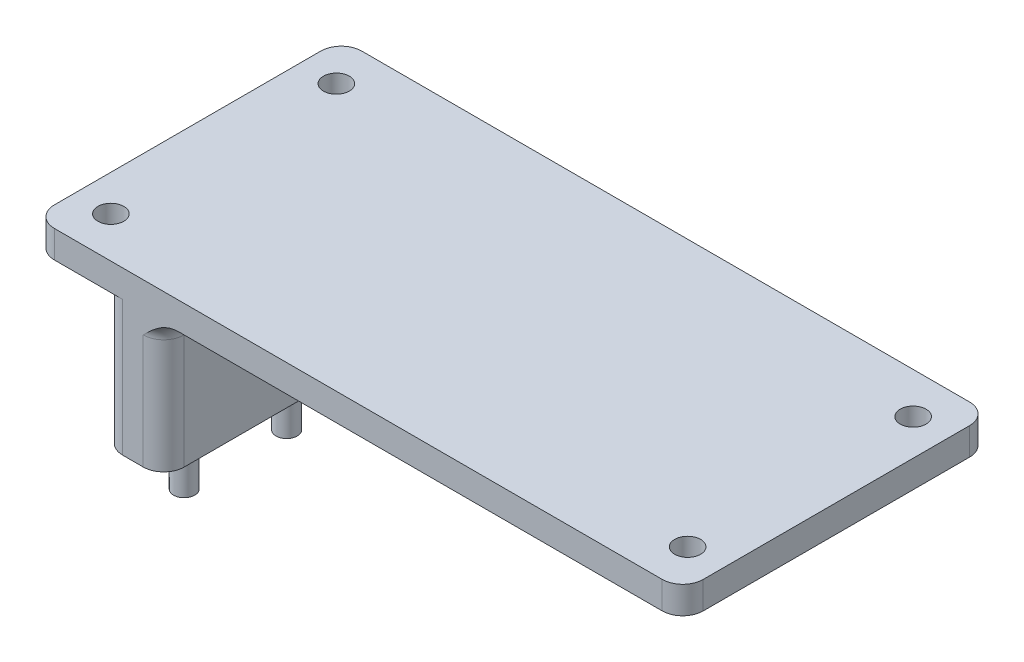
ISO-10303-21;
HEADER;
FILE_DESCRIPTION(('STEP AP214'),'2;1');
FILE_NAME('part.step','',(''),(''),'','','');
FILE_SCHEMA(('AUTOMOTIVE_DESIGN { 1 0 10303 214 1 1 1 1 }'));
ENDSEC;
DATA;
#1=APPLICATION_CONTEXT('core data for automotive mechanical design processes');
#2=APPLICATION_PROTOCOL_DEFINITION('international standard','automotive_design',2000,#1);
#3=PRODUCT_CONTEXT('',#1,'mechanical');
#4=PRODUCT('Part','Part','',(#3));
#5=PRODUCT_RELATED_PRODUCT_CATEGORY('part','',(#4));
#6=PRODUCT_DEFINITION_FORMATION('','',#4);
#7=PRODUCT_DEFINITION_CONTEXT('part definition',#1,'design');
#8=PRODUCT_DEFINITION('design','',#6,#7);
#9=PRODUCT_DEFINITION_SHAPE('','',#8);
#10=(LENGTH_UNIT() NAMED_UNIT(*) SI_UNIT(.MILLI.,.METRE.));
#11=(NAMED_UNIT(*) PLANE_ANGLE_UNIT() SI_UNIT($,.RADIAN.));
#12=(NAMED_UNIT(*) SI_UNIT($,.STERADIAN.) SOLID_ANGLE_UNIT());
#13=UNCERTAINTY_MEASURE_WITH_UNIT(LENGTH_MEASURE(1.E-05),#10,'distance_accuracy_value','');
#14=(GEOMETRIC_REPRESENTATION_CONTEXT(3) GLOBAL_UNCERTAINTY_ASSIGNED_CONTEXT((#13)) GLOBAL_UNIT_ASSIGNED_CONTEXT((#10,
#11,#12)) REPRESENTATION_CONTEXT('',''));
#15=CARTESIAN_POINT('',(0.,0.,0.));
#16=DIRECTION('',(0.,0.,1.));
#17=DIRECTION('',(1.,0.,0.));
#18=AXIS2_PLACEMENT_3D('',#15,#16,#17);
#19=CARTESIAN_POINT('',(0.,23.75,0.));
#20=DIRECTION('',(1.,0.,0.));
#21=DIRECTION('',(0.,0.,-1.));
#22=AXIS2_PLACEMENT_3D('',#19,#20,#21);
#23=PLANE('',#22);
#24=DIRECTION('',(0.,0.,1.));
#25=VECTOR('',#24,1.);
#26=CARTESIAN_POINT('',(0.,0.,0.));
#27=LINE('',#26,#25);
#28=CARTESIAN_POINT('',(0.,0.,-42.));
#29=VERTEX_POINT('',#28);
#30=CARTESIAN_POINT('',(0.,0.,-3.));
#31=VERTEX_POINT('',#30);
#32=EDGE_CURVE('E378',#29,#31,#27,.T.);
#33=ORIENTED_EDGE('',*,*,#32,.T.);
#34=DIRECTION('',(0.,-1.,0.));
#35=VECTOR('',#34,1.);
#36=CARTESIAN_POINT('',(0.,23.75,-3.));
#37=LINE('',#36,#35);
#38=CARTESIAN_POINT('',(0.,19.75,-3.));
#39=VERTEX_POINT('',#38);
#40=EDGE_CURVE('E235',#31,#39,#37,.F.);
#41=ORIENTED_EDGE('',*,*,#40,.T.);
#42=DIRECTION('',(0.,0.,-1.));
#43=VECTOR('',#42,1.);
#44=CARTESIAN_POINT('',(0.,19.75,0.));
#45=LINE('',#44,#43);
#46=CARTESIAN_POINT('',(0.,19.75,-42.));
#47=VERTEX_POINT('',#46);
#48=EDGE_CURVE('E353',#39,#47,#45,.T.);
#49=ORIENTED_EDGE('',*,*,#48,.T.);
#50=DIRECTION('',(0.,-1.,0.));
#51=VECTOR('',#50,1.);
#52=CARTESIAN_POINT('',(0.,23.75,-42.));
#53=LINE('',#52,#51);
#54=EDGE_CURVE('E232',#47,#29,#53,.T.);
#55=ORIENTED_EDGE('',*,*,#54,.T.);
#56=EDGE_LOOP('',(#33,#41,#49,#55));
#57=FACE_BOUND('',#56,.T.);
#58=ADVANCED_FACE('F37',(#57),#23,.F.);
#59=CARTESIAN_POINT('',(0.,23.75,0.));
#60=DIRECTION('',(0.,0.,-1.));
#61=DIRECTION('',(-1.,0.,0.));
#62=AXIS2_PLACEMENT_3D('',#59,#60,#61);
#63=PLANE('',#62);
#64=DIRECTION('',(0.,-1.,0.));
#65=VECTOR('',#64,1.);
#66=CARTESIAN_POINT('',(6.,23.75,0.));
#67=LINE('',#66,#65);
#68=CARTESIAN_POINT('',(6.,0.,0.));
#69=VERTEX_POINT('',#68);
#70=CARTESIAN_POINT('',(6.,16.75,0.));
#71=VERTEX_POINT('',#70);
#72=EDGE_CURVE('E193',#69,#71,#67,.F.);
#73=ORIENTED_EDGE('',*,*,#72,.T.);
#74=CARTESIAN_POINT('',(11.1961524227066,19.75,0.));
#75=CARTESIAN_POINT('',(11.0676094597601,19.750017817897,0.));
#76=CARTESIAN_POINT('',(10.9391415632197,19.7438066101621,0.));
#77=CARTESIAN_POINT('',(10.6834814339214,19.7197793774165,0.));
#78=CARTESIAN_POINT('',(10.5562875584729,19.7019810125627,0.));
#79=CARTESIAN_POINT('',(10.3054246442278,19.655906860044,0.));
#80=CARTESIAN_POINT('',(10.1817316014713,19.6277598752298,0.));
#81=CARTESIAN_POINT('',(9.93689826853327,19.5618415929699,0.));
#82=CARTESIAN_POINT('',(9.815759227778,19.5240656981255,0.));
#83=CARTESIAN_POINT('',(9.53205841876745,19.4241157668209,0.));
#84=CARTESIAN_POINT('',(9.37084844113187,19.3580929987509,0.));
#85=CARTESIAN_POINT('',(9.05495931529576,19.2119880955917,0.));
#86=CARTESIAN_POINT('',(8.90028216404733,19.1319016995748,0.));
#87=CARTESIAN_POINT('',(8.5969466851374,18.9595455356961,0.));
#88=CARTESIAN_POINT('',(8.44832062317108,18.8672194196598,0.));
#89=CARTESIAN_POINT('',(8.1575470372319,18.6728124639701,0.));
#90=CARTESIAN_POINT('',(8.01540251888109,18.5707271653844,0.));
#91=CARTESIAN_POINT('',(7.54022895297814,18.2090242959444,0.));
#92=CARTESIAN_POINT('',(7.22151185225078,17.9307771396003,0.));
#93=CARTESIAN_POINT('',(6.60443675648091,17.354288119049,0.));
#94=CARTESIAN_POINT('',(6.30606317742275,17.0560619149201,0.));
#95=CARTESIAN_POINT('',(6.00516397993799,16.7551639781788,0.));
#96=CARTESIAN_POINT('',(6.00258199109544,16.752581989208,0.));
#97=CARTESIAN_POINT('',(6.,16.75,0.));
#98=B_SPLINE_CURVE_WITH_KNOTS('',3,(#74,#75,#76,#77,#78,#79,#80,#81,#82,#83,#84,#85,#86,#87,#88,
#89,#90,#91,#92,#93,#94,#95,#96,#97),.UNSPECIFIED.,.F.,.F.,(4,2,2,2,2,2,2,2,2,2,2,4),(0.,
0.385368958218362,0.770151940641373,1.1502995039433,1.53062891278463,2.05242008909234,
2.57436962870427,3.09881141308707,3.62349396860826,4.89012609564361,6.15577676525232,
6.16673121643428),.UNSPECIFIED.);
#99=CARTESIAN_POINT('',(11.1961524227066,19.75,0.));
#100=VERTEX_POINT('',#99);
#101=EDGE_CURVE('E11',#71,#100,#98,.F.);
#102=ORIENTED_EDGE('',*,*,#101,.T.);
#103=DIRECTION('',(1.,0.,0.));
#104=VECTOR('',#103,1.);
#105=CARTESIAN_POINT('',(-9.99999999999999,19.75,0.));
#106=LINE('',#105,#104);
#107=CARTESIAN_POINT('',(82.,19.75,0.));
#108=VERTEX_POINT('',#107);
#109=EDGE_CURVE('E166',#100,#108,#106,.T.);
#110=ORIENTED_EDGE('',*,*,#109,.T.);
#111=DIRECTION('',(0.,1.,0.));
#112=VECTOR('',#111,1.);
#113=CARTESIAN_POINT('',(82.,23.75,0.));
#114=LINE('',#113,#112);
#115=CARTESIAN_POINT('',(82.,23.75,0.));
#116=VERTEX_POINT('',#115);
#117=EDGE_CURVE('E171',#108,#116,#114,.T.);
#118=ORIENTED_EDGE('',*,*,#117,.T.);
#119=DIRECTION('',(1.,0.,0.));
#120=VECTOR('',#119,1.);
#121=CARTESIAN_POINT('',(0.,23.75,0.));
#122=LINE('',#121,#120);
#123=CARTESIAN_POINT('',(-6.99999999999999,23.75,0.));
#124=VERTEX_POINT('',#123);
#125=EDGE_CURVE('E381',#124,#116,#122,.T.);
#126=ORIENTED_EDGE('',*,*,#125,.F.);
#127=DIRECTION('',(0.,1.,0.));
#128=VECTOR('',#127,1.);
#129=CARTESIAN_POINT('',(-6.99999999999999,19.75,0.));
#130=LINE('',#129,#128);
#131=CARTESIAN_POINT('',(-6.99999999999999,19.75,0.));
#132=VERTEX_POINT('',#131);
#133=EDGE_CURVE('E386',#124,#132,#130,.F.);
#134=ORIENTED_EDGE('',*,*,#133,.T.);
#135=CARTESIAN_POINT('',(3.,19.75,0.));
#136=VERTEX_POINT('',#135);
#137=EDGE_CURVE('E176',#132,#136,#106,.T.);
#138=ORIENTED_EDGE('',*,*,#137,.T.);
#139=DIRECTION('',(0.,-1.,0.));
#140=VECTOR('',#139,1.);
#141=CARTESIAN_POINT('',(3.,23.75,0.));
#142=LINE('',#141,#140);
#143=CARTESIAN_POINT('',(3.,0.,0.));
#144=VERTEX_POINT('',#143);
#145=EDGE_CURVE('E197',#136,#144,#142,.T.);
#146=ORIENTED_EDGE('',*,*,#145,.T.);
#147=DIRECTION('',(1.,0.,0.));
#148=VECTOR('',#147,1.);
#149=CARTESIAN_POINT('',(0.,0.,0.));
#150=LINE('',#149,#148);
#151=EDGE_CURVE('E388',#144,#69,#150,.T.);
#152=ORIENTED_EDGE('',*,*,#151,.T.);
#153=EDGE_LOOP('',(#73,#102,#110,#118,#126,#134,#138,#146,#152));
#154=FACE_BOUND('',#153,.T.);
#155=ADVANCED_FACE('F168',(#154),#63,.F.);
#156=CARTESIAN_POINT('',(9.,23.75,0.));
#157=DIRECTION('',(-1.,0.,0.));
#158=DIRECTION('',(0.,0.,1.));
#159=AXIS2_PLACEMENT_3D('',#156,#157,#158);
#160=PLANE('',#159);
#161=DIRECTION('',(0.,-1.,0.));
#162=VECTOR('',#161,1.);
#163=CARTESIAN_POINT('',(9.,23.75,-42.));
#164=LINE('',#163,#162);
#165=CARTESIAN_POINT('',(9.,0.,-42.));
#166=VERTEX_POINT('',#165);
#167=CARTESIAN_POINT('',(9.,16.75,-42.));
#168=VERTEX_POINT('',#167);
#169=EDGE_CURVE('E230',#166,#168,#164,.F.);
#170=ORIENTED_EDGE('',*,*,#169,.T.);
#171=DIRECTION('',(0.,0.,1.));
#172=VECTOR('',#171,1.);
#173=CARTESIAN_POINT('',(9.,16.75,0.));
#174=LINE('',#173,#172);
#175=CARTESIAN_POINT('',(9.,16.75,-3.));
#176=VERTEX_POINT('',#175);
#177=EDGE_CURVE('E55',#168,#176,#174,.T.);
#178=ORIENTED_EDGE('',*,*,#177,.T.);
#179=DIRECTION('',(0.,-1.,0.));
#180=VECTOR('',#179,1.);
#181=CARTESIAN_POINT('',(9.,23.75,-3.));
#182=LINE('',#181,#180);
#183=CARTESIAN_POINT('',(9.,0.,-3.));
#184=VERTEX_POINT('',#183);
#185=EDGE_CURVE('E228',#176,#184,#182,.T.);
#186=ORIENTED_EDGE('',*,*,#185,.T.);
#187=DIRECTION('',(0.,0.,-1.));
#188=VECTOR('',#187,1.);
#189=CARTESIAN_POINT('',(9.,0.,0.));
#190=LINE('',#189,#188);
#191=EDGE_CURVE('E391',#184,#166,#190,.T.);
#192=ORIENTED_EDGE('',*,*,#191,.T.);
#193=EDGE_LOOP('',(#170,#178,#186,#192));
#194=FACE_BOUND('',#193,.T.);
#195=ADVANCED_FACE('F298',(#194),#160,.F.);
#196=CARTESIAN_POINT('',(0.,23.75,-44.9999999999999));
#197=DIRECTION('',(0.,0.,1.));
#198=DIRECTION('',(1.,0.,0.));
#199=AXIS2_PLACEMENT_3D('',#196,#197,#198);
#200=PLANE('',#199);
#201=DIRECTION('',(-1.,0.,0.));
#202=VECTOR('',#201,1.);
#203=CARTESIAN_POINT('',(0.,23.75,-44.9999999999999));
#204=LINE('',#203,#202);
#205=CARTESIAN_POINT('',(82.,23.75,-45.0000000000006));
#206=VERTEX_POINT('',#205);
#207=CARTESIAN_POINT('',(-7.00000000000002,23.75,-44.9999999999999));
#208=VERTEX_POINT('',#207);
#209=EDGE_CURVE('E383',#206,#208,#204,.T.);
#210=ORIENTED_EDGE('',*,*,#209,.F.);
#211=DIRECTION('',(0.,1.,0.));
#212=VECTOR('',#211,1.);
#213=CARTESIAN_POINT('',(82.,19.75,-45.0000000000006));
#214=LINE('',#213,#212);
#215=CARTESIAN_POINT('',(82.,19.75,-45.));
#216=VERTEX_POINT('',#215);
#217=EDGE_CURVE('E218',#206,#216,#214,.F.);
#218=ORIENTED_EDGE('',*,*,#217,.T.);
#219=DIRECTION('',(-1.,0.,0.));
#220=VECTOR('',#219,1.);
#221=CARTESIAN_POINT('',(-9.99999999999999,19.75,-45.));
#222=LINE('',#221,#220);
#223=CARTESIAN_POINT('',(11.1961524227066,19.75,-45.));
#224=VERTEX_POINT('',#223);
#225=EDGE_CURVE('E345',#216,#224,#222,.T.);
#226=ORIENTED_EDGE('',*,*,#225,.T.);
#227=CARTESIAN_POINT('',(11.1961524227066,19.75,-45.));
#228=CARTESIAN_POINT('',(11.0676094597598,19.750017817897,-45.));
#229=CARTESIAN_POINT('',(10.9391415632193,19.7438066101621,-45.));
#230=CARTESIAN_POINT('',(10.6834814339205,19.7197793774164,-45.));
#231=CARTESIAN_POINT('',(10.5562875584718,19.7019810125626,-45.));
#232=CARTESIAN_POINT('',(10.3054246442267,19.6559068600438,-45.));
#233=CARTESIAN_POINT('',(10.1817316014704,19.6277598752296,-45.));
#234=CARTESIAN_POINT('',(9.93689826853282,19.5618415929698,-45.));
#235=CARTESIAN_POINT('',(9.81575922777776,19.5240656981255,-45.));
#236=CARTESIAN_POINT('',(9.53205841876762,19.424115766821,-45.));
#237=CARTESIAN_POINT('',(9.37084844113223,19.358092998751,-45.));
#238=CARTESIAN_POINT('',(9.05495931529641,19.2119880955921,-45.));
#239=CARTESIAN_POINT('',(8.9002821640481,19.1319016995752,-45.));
#240=CARTESIAN_POINT('',(8.59694668513814,18.9595455356965,-45.));
#241=CARTESIAN_POINT('',(8.44832062317169,18.8672194196602,-45.));
#242=CARTESIAN_POINT('',(8.15754703723208,18.6728124639704,-45.));
#243=CARTESIAN_POINT('',(8.01540251888098,18.5707271653847,-45.));
#244=CARTESIAN_POINT('',(7.54022895297852,18.2090242959437,-45.));
#245=CARTESIAN_POINT('',(7.22151185225383,17.9307771395967,-45.));
#246=CARTESIAN_POINT('',(6.60443675647731,17.3542881190521,-45.));
#247=CARTESIAN_POINT('',(6.30606317740982,17.0560619149328,-45.));
#248=CARTESIAN_POINT('',(6.00516397993779,16.7551639781791,-45.));
#249=CARTESIAN_POINT('',(6.00258199109532,16.7525819892081,-45.));
#250=CARTESIAN_POINT('',(5.99999999999998,16.75,-45.));
#251=B_SPLINE_CURVE_WITH_KNOTS('',3,(#227,#228,#229,#230,#231,#232,#233,#234,#235,#236,#237,
#238,#239,#240,#241,#242,#243,#244,#245,#246,#247,#248,#249,#250),.UNSPECIFIED.,.F.,.F.,(4,2,2,
2,2,2,2,2,2,2,2,4),(0.,0.385368958219026,0.77015194064273,1.15029950394399,1.53062891278463,
2.05242008909176,2.57436962870319,3.09881141308661,3.62349396860824,4.89012609564416,
6.15577676525226,6.1667312164343),.UNSPECIFIED.);
#252=CARTESIAN_POINT('',(5.99999999999998,16.75,-45.));
#253=VERTEX_POINT('',#252);
#254=EDGE_CURVE('E47',#224,#253,#251,.T.);
#255=ORIENTED_EDGE('',*,*,#254,.T.);
#256=DIRECTION('',(0.,-1.,0.));
#257=VECTOR('',#256,1.);
#258=CARTESIAN_POINT('',(5.99999999999998,23.75,-45.));
#259=LINE('',#258,#257);
#260=CARTESIAN_POINT('',(5.99999999999998,0.,-45.));
#261=VERTEX_POINT('',#260);
#262=EDGE_CURVE('E216',#253,#261,#259,.T.);
#263=ORIENTED_EDGE('',*,*,#262,.T.);
#264=DIRECTION('',(-1.,0.,0.));
#265=VECTOR('',#264,1.);
#266=CARTESIAN_POINT('',(0.,0.,-44.9999999999999));
#267=LINE('',#266,#265);
#268=CARTESIAN_POINT('',(2.99999999999998,0.,-45.));
#269=VERTEX_POINT('',#268);
#270=EDGE_CURVE('E384',#261,#269,#267,.T.);
#271=ORIENTED_EDGE('',*,*,#270,.T.);
#272=DIRECTION('',(0.,-1.,0.));
#273=VECTOR('',#272,1.);
#274=CARTESIAN_POINT('',(2.99999999999998,23.75,-45.));
#275=LINE('',#274,#273);
#276=CARTESIAN_POINT('',(2.99999999999998,19.75,-45.));
#277=VERTEX_POINT('',#276);
#278=EDGE_CURVE('E213',#269,#277,#275,.F.);
#279=ORIENTED_EDGE('',*,*,#278,.T.);
#280=CARTESIAN_POINT('',(-7.00000000000002,19.75,-45.));
#281=VERTEX_POINT('',#280);
#282=EDGE_CURVE('E337',#277,#281,#222,.T.);
#283=ORIENTED_EDGE('',*,*,#282,.T.);
#284=DIRECTION('',(0.,1.,0.));
#285=VECTOR('',#284,1.);
#286=CARTESIAN_POINT('',(-7.00000000000002,23.75,-44.9999999999999));
#287=LINE('',#286,#285);
#288=EDGE_CURVE('E187',#281,#208,#287,.T.);
#289=ORIENTED_EDGE('',*,*,#288,.T.);
#290=EDGE_LOOP('',(#210,#218,#226,#255,#263,#271,#279,#283,#289));
#291=FACE_BOUND('',#290,.T.);
#292=ADVANCED_FACE('F273',(#291),#200,.F.);
#293=CARTESIAN_POINT('',(0.,23.75,0.));
#294=DIRECTION('',(0.,-1.,0.));
#295=DIRECTION('',(0.,0.,-1.));
#296=AXIS2_PLACEMENT_3D('',#293,#294,#295);
#297=PLANE('',#296);
#298=CARTESIAN_POINT('',(-4.7275,23.75,-39.01));
#299=DIRECTION('',(0.,1.,0.));
#300=DIRECTION('',(0.,0.,1.));
#301=AXIS2_PLACEMENT_3D('',#298,#299,#300);
#302=CIRCLE('',#301,1.89864999999999);
#303=CARTESIAN_POINT('',(-4.7275,23.75,-37.11135));
#304=VERTEX_POINT('',#303);
#305=EDGE_CURVE('E403',#304,#304,#302,.T.);
#306=ORIENTED_EDGE('',*,*,#305,.F.);
#307=EDGE_LOOP('',(#306));
#308=FACE_BOUND('',#307,.T.);
#309=CARTESIAN_POINT('',(79.7275,23.75,-39.01));
#310=DIRECTION('',(0.,1.,0.));
#311=DIRECTION('',(0.,0.,1.));
#312=AXIS2_PLACEMENT_3D('',#309,#310,#311);
#313=CIRCLE('',#312,1.89864999999999);
#314=CARTESIAN_POINT('',(79.7275,23.75,-37.11135));
#315=VERTEX_POINT('',#314);
#316=EDGE_CURVE('E399',#315,#315,#313,.T.);
#317=ORIENTED_EDGE('',*,*,#316,.F.);
#318=EDGE_LOOP('',(#317));
#319=FACE_BOUND('',#318,.T.);
#320=CARTESIAN_POINT('',(79.7275,23.75,-5.99000000000001));
#321=DIRECTION('',(0.,1.,0.));
#322=DIRECTION('',(0.,0.,1.));
#323=AXIS2_PLACEMENT_3D('',#320,#321,#322);
#324=CIRCLE('',#323,1.89864999999999);
#325=CARTESIAN_POINT('',(79.7275,23.75,-4.09135000000002));
#326=VERTEX_POINT('',#325);
#327=EDGE_CURVE('E398',#326,#326,#324,.T.);
#328=ORIENTED_EDGE('',*,*,#327,.F.);
#329=EDGE_LOOP('',(#328));
#330=FACE_BOUND('',#329,.T.);
#331=CARTESIAN_POINT('',(-4.7275,23.75,-5.99000000000001));
#332=DIRECTION('',(0.,1.,0.));
#333=DIRECTION('',(0.,0.,1.));
#334=AXIS2_PLACEMENT_3D('',#331,#332,#333);
#335=CIRCLE('',#334,1.89864999999999);
#336=CARTESIAN_POINT('',(-4.7275,23.75,-4.09135000000002));
#337=VERTEX_POINT('',#336);
#338=EDGE_CURVE('E691',#337,#337,#335,.T.);
#339=ORIENTED_EDGE('',*,*,#338,.F.);
#340=EDGE_LOOP('',(#339));
#341=FACE_BOUND('',#340,.T.);
#342=ORIENTED_EDGE('',*,*,#125,.T.);
#343=CARTESIAN_POINT('',(82.,23.75,-3.));
#344=DIRECTION('',(0.,-1.,0.));
#345=DIRECTION('',(0.,0.,-1.));
#346=AXIS2_PLACEMENT_3D('',#343,#344,#345);
#347=CIRCLE('',#346,3.);
#348=CARTESIAN_POINT('',(85.,23.75,-3.));
#349=VERTEX_POINT('',#348);
#350=EDGE_CURVE('E191',#116,#349,#347,.F.);
#351=ORIENTED_EDGE('',*,*,#350,.T.);
#352=DIRECTION('',(0.,0.,-1.));
#353=VECTOR('',#352,1.);
#354=CARTESIAN_POINT('',(85.,23.75,0.));
#355=LINE('',#354,#353);
#356=CARTESIAN_POINT('',(85.,23.75,-42.0000000000005));
#357=VERTEX_POINT('',#356);
#358=EDGE_CURVE('E354',#349,#357,#355,.T.);
#359=ORIENTED_EDGE('',*,*,#358,.T.);
#360=CARTESIAN_POINT('',(82.,23.75,-42.0000000000006));
#361=DIRECTION('',(0.,-1.,0.));
#362=DIRECTION('',(0.,0.,-1.));
#363=AXIS2_PLACEMENT_3D('',#360,#361,#362);
#364=CIRCLE('',#363,3.);
#365=EDGE_CURVE('E202',#357,#206,#364,.F.);
#366=ORIENTED_EDGE('',*,*,#365,.T.);
#367=ORIENTED_EDGE('',*,*,#209,.T.);
#368=CARTESIAN_POINT('',(-6.99999999999999,23.75,-41.9999999999999));
#369=DIRECTION('',(0.,-1.,0.));
#370=DIRECTION('',(0.,0.,-1.));
#371=AXIS2_PLACEMENT_3D('',#368,#369,#370);
#372=CIRCLE('',#371,3.);
#373=CARTESIAN_POINT('',(-9.99999999999999,23.75,-41.9999999999999));
#374=VERTEX_POINT('',#373);
#375=EDGE_CURVE('E195',#208,#374,#372,.F.);
#376=ORIENTED_EDGE('',*,*,#375,.T.);
#377=DIRECTION('',(0.,0.,1.));
#378=VECTOR('',#377,1.);
#379=CARTESIAN_POINT('',(-9.99999999999999,23.75,0.));
#380=LINE('',#379,#378);
#381=CARTESIAN_POINT('',(-9.99999999999999,23.75,-3.));
#382=VERTEX_POINT('',#381);
#383=EDGE_CURVE('E348',#374,#382,#380,.T.);
#384=ORIENTED_EDGE('',*,*,#383,.T.);
#385=CARTESIAN_POINT('',(-6.99999999999999,23.75,-3.));
#386=DIRECTION('',(0.,-1.,0.));
#387=DIRECTION('',(0.,0.,-1.));
#388=AXIS2_PLACEMENT_3D('',#385,#386,#387);
#389=CIRCLE('',#388,3.);
#390=EDGE_CURVE('E192',#382,#124,#389,.F.);
#391=ORIENTED_EDGE('',*,*,#390,.T.);
#392=EDGE_LOOP('',(#342,#351,#359,#366,#367,#376,#384,#391));
#393=FACE_BOUND('',#392,.T.);
#394=ADVANCED_FACE('F436',(#308,#319,#330,#341,#393),#297,.F.);
#395=CARTESIAN_POINT('',(0.,0.,0.));
#396=DIRECTION('',(0.,-1.,0.));
#397=DIRECTION('',(0.,0.,-1.));
#398=AXIS2_PLACEMENT_3D('',#395,#396,#397);
#399=PLANE('',#398);
#400=CARTESIAN_POINT('',(4.5,0.,-37.5));
#401=DIRECTION('',(0.,-1.,0.));
#402=DIRECTION('',(0.,0.,-1.));
#403=AXIS2_PLACEMENT_3D('',#400,#401,#402);
#404=CIRCLE('',#403,1.55);
#405=CARTESIAN_POINT('',(4.5,0.,-39.05));
#406=VERTEX_POINT('',#405);
#407=EDGE_CURVE('E362',#406,#406,#404,.T.);
#408=ORIENTED_EDGE('',*,*,#407,.F.);
#409=EDGE_LOOP('',(#408));
#410=FACE_BOUND('',#409,.T.);
#411=CARTESIAN_POINT('',(4.5,0.,-7.49999999999997));
#412=DIRECTION('',(0.,-1.,0.));
#413=DIRECTION('',(0.,0.,-1.));
#414=AXIS2_PLACEMENT_3D('',#411,#412,#413);
#415=CIRCLE('',#414,1.55);
#416=CARTESIAN_POINT('',(4.5,0.,-9.04999999999997));
#417=VERTEX_POINT('',#416);
#418=EDGE_CURVE('E366',#417,#417,#415,.T.);
#419=ORIENTED_EDGE('',*,*,#418,.F.);
#420=EDGE_LOOP('',(#419));
#421=FACE_BOUND('',#420,.T.);
#422=CARTESIAN_POINT('',(4.5,0.,-22.5));
#423=DIRECTION('',(0.,-1.,0.));
#424=DIRECTION('',(0.,0.,-1.));
#425=AXIS2_PLACEMENT_3D('',#422,#423,#424);
#426=CIRCLE('',#425,1.55);
#427=CARTESIAN_POINT('',(4.5,0.,-24.05));
#428=VERTEX_POINT('',#427);
#429=EDGE_CURVE('E372',#428,#428,#426,.T.);
#430=ORIENTED_EDGE('',*,*,#429,.F.);
#431=EDGE_LOOP('',(#430));
#432=FACE_BOUND('',#431,.T.);
#433=ORIENTED_EDGE('',*,*,#270,.F.);
#434=CARTESIAN_POINT('',(6.,0.,-42.));
#435=DIRECTION('',(0.,-1.,0.));
#436=DIRECTION('',(0.,0.,-1.));
#437=AXIS2_PLACEMENT_3D('',#434,#435,#436);
#438=CIRCLE('',#437,3.);
#439=EDGE_CURVE('E226',#261,#166,#438,.T.);
#440=ORIENTED_EDGE('',*,*,#439,.T.);
#441=ORIENTED_EDGE('',*,*,#191,.F.);
#442=CARTESIAN_POINT('',(6.,0.,-3.));
#443=DIRECTION('',(0.,-1.,0.));
#444=DIRECTION('',(0.,0.,-1.));
#445=AXIS2_PLACEMENT_3D('',#442,#443,#444);
#446=CIRCLE('',#445,3.);
#447=EDGE_CURVE('E224',#184,#69,#446,.T.);
#448=ORIENTED_EDGE('',*,*,#447,.T.);
#449=ORIENTED_EDGE('',*,*,#151,.F.);
#450=CARTESIAN_POINT('',(3.,0.,-3.));
#451=DIRECTION('',(0.,-1.,0.));
#452=DIRECTION('',(0.,0.,-1.));
#453=AXIS2_PLACEMENT_3D('',#450,#451,#452);
#454=CIRCLE('',#453,3.);
#455=EDGE_CURVE('E222',#144,#31,#454,.T.);
#456=ORIENTED_EDGE('',*,*,#455,.T.);
#457=ORIENTED_EDGE('',*,*,#32,.F.);
#458=CARTESIAN_POINT('',(3.,0.,-42.));
#459=DIRECTION('',(0.,-1.,0.));
#460=DIRECTION('',(0.,0.,-1.));
#461=AXIS2_PLACEMENT_3D('',#458,#459,#460);
#462=CIRCLE('',#461,3.);
#463=EDGE_CURVE('E220',#29,#269,#462,.T.);
#464=ORIENTED_EDGE('',*,*,#463,.T.);
#465=EDGE_LOOP('',(#433,#440,#441,#448,#449,#456,#457,#464));
#466=FACE_BOUND('',#465,.T.);
#467=ADVANCED_FACE('F411',(#410,#421,#432,#466),#399,.T.);
#468=CARTESIAN_POINT('',(4.5,-7.3,-22.5));
#469=DIRECTION('',(0.,1.,0.));
#470=DIRECTION('',(0.,0.,1.));
#471=AXIS2_PLACEMENT_3D('',#468,#469,#470);
#472=CYLINDRICAL_SURFACE('',#471,1.55);
#473=CARTESIAN_POINT('',(4.5,-7.3,-22.5));
#474=DIRECTION('',(0.,-1.,0.));
#475=DIRECTION('',(0.,0.,-1.));
#476=AXIS2_PLACEMENT_3D('',#473,#474,#475);
#477=CIRCLE('',#476,1.55);
#478=CARTESIAN_POINT('',(4.5,-7.3,-24.05));
#479=VERTEX_POINT('',#478);
#480=EDGE_CURVE('E375',#479,#479,#477,.T.);
#481=ORIENTED_EDGE('',*,*,#480,.F.);
#482=EDGE_LOOP('',(#481));
#483=FACE_BOUND('',#482,.T.);
#484=ORIENTED_EDGE('',*,*,#429,.T.);
#485=EDGE_LOOP('',(#484));
#486=FACE_BOUND('',#485,.T.);
#487=ADVANCED_FACE('F471',(#483,#486),#472,.T.);
#488=CARTESIAN_POINT('',(4.5,-7.3,-22.5));
#489=DIRECTION('',(0.,-1.,0.));
#490=DIRECTION('',(0.,0.,-1.));
#491=AXIS2_PLACEMENT_3D('',#488,#489,#490);
#492=PLANE('',#491);
#493=ORIENTED_EDGE('',*,*,#480,.T.);
#494=EDGE_LOOP('',(#493));
#495=FACE_BOUND('',#494,.T.);
#496=ADVANCED_FACE('F467',(#495),#492,.T.);
#497=CARTESIAN_POINT('',(4.5,-7.3,-7.49999999999997));
#498=DIRECTION('',(0.,1.,0.));
#499=DIRECTION('',(0.,0.,1.));
#500=AXIS2_PLACEMENT_3D('',#497,#498,#499);
#501=CYLINDRICAL_SURFACE('',#500,1.55);
#502=CARTESIAN_POINT('',(4.5,-7.3,-7.49999999999997));
#503=DIRECTION('',(0.,-1.,0.));
#504=DIRECTION('',(0.,0.,-1.));
#505=AXIS2_PLACEMENT_3D('',#502,#503,#504);
#506=CIRCLE('',#505,1.55);
#507=CARTESIAN_POINT('',(4.5,-7.3,-9.04999999999997));
#508=VERTEX_POINT('',#507);
#509=EDGE_CURVE('E369',#508,#508,#506,.T.);
#510=ORIENTED_EDGE('',*,*,#509,.F.);
#511=EDGE_LOOP('',(#510));
#512=FACE_BOUND('',#511,.T.);
#513=ORIENTED_EDGE('',*,*,#418,.T.);
#514=EDGE_LOOP('',(#513));
#515=FACE_BOUND('',#514,.T.);
#516=ADVANCED_FACE('F463',(#512,#515),#501,.T.);
#517=CARTESIAN_POINT('',(4.5,-7.3,-7.49999999999997));
#518=DIRECTION('',(0.,-1.,0.));
#519=DIRECTION('',(0.,0.,-1.));
#520=AXIS2_PLACEMENT_3D('',#517,#518,#519);
#521=PLANE('',#520);
#522=ORIENTED_EDGE('',*,*,#509,.T.);
#523=EDGE_LOOP('',(#522));
#524=FACE_BOUND('',#523,.T.);
#525=ADVANCED_FACE('F459',(#524),#521,.T.);
#526=CARTESIAN_POINT('',(4.5,-7.3,-37.5));
#527=DIRECTION('',(0.,1.,0.));
#528=DIRECTION('',(0.,0.,1.));
#529=AXIS2_PLACEMENT_3D('',#526,#527,#528);
#530=CYLINDRICAL_SURFACE('',#529,1.55);
#531=CARTESIAN_POINT('',(4.5,-7.3,-37.5));
#532=DIRECTION('',(0.,-1.,0.));
#533=DIRECTION('',(0.,0.,-1.));
#534=AXIS2_PLACEMENT_3D('',#531,#532,#533);
#535=CIRCLE('',#534,1.55);
#536=CARTESIAN_POINT('',(4.5,-7.3,-39.05));
#537=VERTEX_POINT('',#536);
#538=EDGE_CURVE('E363',#537,#537,#535,.T.);
#539=ORIENTED_EDGE('',*,*,#538,.F.);
#540=EDGE_LOOP('',(#539));
#541=FACE_BOUND('',#540,.T.);
#542=ORIENTED_EDGE('',*,*,#407,.T.);
#543=EDGE_LOOP('',(#542));
#544=FACE_BOUND('',#543,.T.);
#545=ADVANCED_FACE('F452',(#541,#544),#530,.T.);
#546=CARTESIAN_POINT('',(4.5,-7.3,-37.5));
#547=DIRECTION('',(0.,-1.,0.));
#548=DIRECTION('',(0.,0.,-1.));
#549=AXIS2_PLACEMENT_3D('',#546,#547,#548);
#550=PLANE('',#549);
#551=ORIENTED_EDGE('',*,*,#538,.T.);
#552=EDGE_LOOP('',(#551));
#553=FACE_BOUND('',#552,.T.);
#554=ADVANCED_FACE('F444',(#553),#550,.T.);
#555=CARTESIAN_POINT('',(85.,19.75,0.));
#556=DIRECTION('',(1.,0.,0.));
#557=DIRECTION('',(0.,0.,-1.));
#558=AXIS2_PLACEMENT_3D('',#555,#556,#557);
#559=PLANE('',#558);
#560=ORIENTED_EDGE('',*,*,#358,.F.);
#561=DIRECTION('',(0.,1.,0.));
#562=VECTOR('',#561,1.);
#563=CARTESIAN_POINT('',(85.,19.75,-3.));
#564=LINE('',#563,#562);
#565=CARTESIAN_POINT('',(85.,19.75,-3.));
#566=VERTEX_POINT('',#565);
#567=EDGE_CURVE('E208',#349,#566,#564,.F.);
#568=ORIENTED_EDGE('',*,*,#567,.T.);
#569=DIRECTION('',(0.,0.,-1.));
#570=VECTOR('',#569,1.);
#571=CARTESIAN_POINT('',(85.,19.75,0.));
#572=LINE('',#571,#570);
#573=CARTESIAN_POINT('',(85.,19.75,-42.0000000000005));
#574=VERTEX_POINT('',#573);
#575=EDGE_CURVE('E184',#566,#574,#572,.T.);
#576=ORIENTED_EDGE('',*,*,#575,.T.);
#577=DIRECTION('',(0.,1.,0.));
#578=VECTOR('',#577,1.);
#579=CARTESIAN_POINT('',(85.,23.75,-42.0000000000006));
#580=LINE('',#579,#578);
#581=EDGE_CURVE('E205',#574,#357,#580,.T.);
#582=ORIENTED_EDGE('',*,*,#581,.T.);
#583=EDGE_LOOP('',(#560,#568,#576,#582));
#584=FACE_BOUND('',#583,.T.);
#585=ADVANCED_FACE('F442',(#584),#559,.T.);
#586=CARTESIAN_POINT('',(0.,19.75,0.));
#587=DIRECTION('',(0.,-1.,0.));
#588=DIRECTION('',(0.,0.,-1.));
#589=AXIS2_PLACEMENT_3D('',#586,#587,#588);
#590=PLANE('',#589);
#591=CARTESIAN_POINT('',(79.7275,19.75,-39.01));
#592=DIRECTION('',(0.,-1.,0.));
#593=DIRECTION('',(0.,0.,-1.));
#594=AXIS2_PLACEMENT_3D('',#591,#592,#593);
#595=CIRCLE('',#594,1.89864999999999);
#596=CARTESIAN_POINT('',(79.7275,19.75,-40.90865));
#597=VERTEX_POINT('',#596);
#598=EDGE_CURVE('E395',#597,#597,#595,.T.);
#599=ORIENTED_EDGE('',*,*,#598,.F.);
#600=EDGE_LOOP('',(#599));
#601=FACE_BOUND('',#600,.T.);
#602=CARTESIAN_POINT('',(79.7275,19.75,-5.99000000000001));
#603=DIRECTION('',(0.,-1.,0.));
#604=DIRECTION('',(0.,0.,-1.));
#605=AXIS2_PLACEMENT_3D('',#602,#603,#604);
#606=CIRCLE('',#605,1.89864999999999);
#607=CARTESIAN_POINT('',(79.7275,19.75,-7.88864999999999));
#608=VERTEX_POINT('',#607);
#609=EDGE_CURVE('E693',#608,#608,#606,.T.);
#610=ORIENTED_EDGE('',*,*,#609,.F.);
#611=EDGE_LOOP('',(#610));
#612=FACE_BOUND('',#611,.T.);
#613=DIRECTION('',(0.,0.,1.));
#614=VECTOR('',#613,1.);
#615=CARTESIAN_POINT('',(12.,19.75,0.));
#616=LINE('',#615,#614);
#617=CARTESIAN_POINT('',(12.,19.75,-3.));
#618=VERTEX_POINT('',#617);
#619=CARTESIAN_POINT('',(12.,19.75,-42.));
#620=VERTEX_POINT('',#619);
#621=EDGE_CURVE('E251',#618,#620,#616,.F.);
#622=ORIENTED_EDGE('',*,*,#621,.T.);
#623=CARTESIAN_POINT('',(6.,19.75,-42.));
#624=DIRECTION('',(0.,-1.,0.));
#625=DIRECTION('',(0.,0.,-1.));
#626=AXIS2_PLACEMENT_3D('',#623,#624,#625);
#627=CIRCLE('',#626,6.);
#628=EDGE_CURVE('E255',#620,#224,#627,.F.);
#629=ORIENTED_EDGE('',*,*,#628,.T.);
#630=ORIENTED_EDGE('',*,*,#225,.F.);
#631=CARTESIAN_POINT('',(82.,19.75,-42.0000000000006));
#632=DIRECTION('',(0.,-1.,0.));
#633=DIRECTION('',(0.,0.,-1.));
#634=AXIS2_PLACEMENT_3D('',#631,#632,#633);
#635=CIRCLE('',#634,3.);
#636=EDGE_CURVE('E188',#216,#574,#635,.T.);
#637=ORIENTED_EDGE('',*,*,#636,.T.);
#638=ORIENTED_EDGE('',*,*,#575,.F.);
#639=CARTESIAN_POINT('',(82.,19.75,-3.));
#640=DIRECTION('',(0.,-1.,0.));
#641=DIRECTION('',(0.,0.,-1.));
#642=AXIS2_PLACEMENT_3D('',#639,#640,#641);
#643=CIRCLE('',#642,3.);
#644=EDGE_CURVE('E181',#566,#108,#643,.T.);
#645=ORIENTED_EDGE('',*,*,#644,.T.);
#646=ORIENTED_EDGE('',*,*,#109,.F.);
#647=CARTESIAN_POINT('',(6.,19.75,-3.));
#648=DIRECTION('',(0.,-1.,0.));
#649=DIRECTION('',(0.,0.,-1.));
#650=AXIS2_PLACEMENT_3D('',#647,#648,#649);
#651=CIRCLE('',#650,6.);
#652=EDGE_CURVE('E253',#100,#618,#651,.F.);
#653=ORIENTED_EDGE('',*,*,#652,.T.);
#654=EDGE_LOOP('',(#622,#629,#630,#637,#638,#645,#646,#653));
#655=FACE_BOUND('',#654,.T.);
#656=ADVANCED_FACE('F182',(#601,#612,#655),#590,.T.);
#657=CARTESIAN_POINT('',(-4.7275,19.75,-39.01));
#658=DIRECTION('',(0.,-1.,0.));
#659=DIRECTION('',(0.,0.,-1.));
#660=AXIS2_PLACEMENT_3D('',#657,#658,#659);
#661=CIRCLE('',#660,1.89864999999999);
#662=CARTESIAN_POINT('',(-4.7275,19.75,-40.90865));
#663=VERTEX_POINT('',#662);
#664=EDGE_CURVE('E400',#663,#663,#661,.T.);
#665=ORIENTED_EDGE('',*,*,#664,.F.);
#666=EDGE_LOOP('',(#665));
#667=FACE_BOUND('',#666,.T.);
#668=CARTESIAN_POINT('',(-4.7275,19.75,-5.99000000000001));
#669=DIRECTION('',(0.,-1.,0.));
#670=DIRECTION('',(0.,0.,-1.));
#671=AXIS2_PLACEMENT_3D('',#668,#669,#670);
#672=CIRCLE('',#671,1.89864999999999);
#673=CARTESIAN_POINT('',(-4.7275,19.75,-7.88865));
#674=VERTEX_POINT('',#673);
#675=EDGE_CURVE('E357',#674,#674,#672,.T.);
#676=ORIENTED_EDGE('',*,*,#675,.F.);
#677=EDGE_LOOP('',(#676));
#678=FACE_BOUND('',#677,.T.);
#679=DIRECTION('',(0.,0.,1.));
#680=VECTOR('',#679,1.);
#681=CARTESIAN_POINT('',(-9.99999999999999,19.75,0.));
#682=LINE('',#681,#680);
#683=CARTESIAN_POINT('',(-9.99999999999999,19.75,-41.9999999999999));
#684=VERTEX_POINT('',#683);
#685=CARTESIAN_POINT('',(-9.99999999999999,19.75,-3.));
#686=VERTEX_POINT('',#685);
#687=EDGE_CURVE('E177',#684,#686,#682,.T.);
#688=ORIENTED_EDGE('',*,*,#687,.F.);
#689=CARTESIAN_POINT('',(-6.99999999999999,19.75,-41.9999999999999));
#690=DIRECTION('',(0.,-1.,0.));
#691=DIRECTION('',(0.,0.,-1.));
#692=AXIS2_PLACEMENT_3D('',#689,#690,#691);
#693=CIRCLE('',#692,3.);
#694=EDGE_CURVE('E244',#684,#281,#693,.T.);
#695=ORIENTED_EDGE('',*,*,#694,.T.);
#696=ORIENTED_EDGE('',*,*,#282,.F.);
#697=CARTESIAN_POINT('',(3.,19.75,-42.));
#698=DIRECTION('',(0.,-1.,0.));
#699=DIRECTION('',(0.,0.,-1.));
#700=AXIS2_PLACEMENT_3D('',#697,#698,#699);
#701=CIRCLE('',#700,3.);
#702=EDGE_CURVE('E249',#277,#47,#701,.F.);
#703=ORIENTED_EDGE('',*,*,#702,.T.);
#704=ORIENTED_EDGE('',*,*,#48,.F.);
#705=CARTESIAN_POINT('',(3.,19.75,-3.));
#706=DIRECTION('',(0.,-1.,0.));
#707=DIRECTION('',(0.,0.,-1.));
#708=AXIS2_PLACEMENT_3D('',#705,#706,#707);
#709=CIRCLE('',#708,3.);
#710=EDGE_CURVE('E246',#39,#136,#709,.F.);
#711=ORIENTED_EDGE('',*,*,#710,.T.);
#712=ORIENTED_EDGE('',*,*,#137,.F.);
#713=CARTESIAN_POINT('',(-6.99999999999999,19.75,-3.));
#714=DIRECTION('',(0.,-1.,0.));
#715=DIRECTION('',(0.,0.,-1.));
#716=AXIS2_PLACEMENT_3D('',#713,#714,#715);
#717=CIRCLE('',#716,3.);
#718=EDGE_CURVE('E242',#132,#686,#717,.T.);
#719=ORIENTED_EDGE('',*,*,#718,.T.);
#720=EDGE_LOOP('',(#688,#695,#696,#703,#704,#711,#712,#719));
#721=FACE_BOUND('',#720,.T.);
#722=ADVANCED_FACE('F336',(#667,#678,#721),#590,.T.);
#723=CARTESIAN_POINT('',(-9.99999999999999,19.75,0.));
#724=DIRECTION('',(-1.,0.,0.));
#725=DIRECTION('',(0.,0.,1.));
#726=AXIS2_PLACEMENT_3D('',#723,#724,#725);
#727=PLANE('',#726);
#728=ORIENTED_EDGE('',*,*,#383,.F.);
#729=DIRECTION('',(0.,1.,0.));
#730=VECTOR('',#729,1.);
#731=CARTESIAN_POINT('',(-9.99999999999999,19.75,-41.9999999999999));
#732=LINE('',#731,#730);
#733=EDGE_CURVE('E240',#374,#684,#732,.F.);
#734=ORIENTED_EDGE('',*,*,#733,.T.);
#735=ORIENTED_EDGE('',*,*,#687,.T.);
#736=DIRECTION('',(0.,1.,0.));
#737=VECTOR('',#736,1.);
#738=CARTESIAN_POINT('',(-9.99999999999999,23.75,-3.));
#739=LINE('',#738,#737);
#740=EDGE_CURVE('E237',#686,#382,#739,.T.);
#741=ORIENTED_EDGE('',*,*,#740,.T.);
#742=EDGE_LOOP('',(#728,#734,#735,#741));
#743=FACE_BOUND('',#742,.T.);
#744=ADVANCED_FACE('F434',(#743),#727,.T.);
#745=CARTESIAN_POINT('',(-4.7275,23.75,-5.99000000000001));
#746=DIRECTION('',(0.,1.,0.));
#747=DIRECTION('',(0.,0.,1.));
#748=AXIS2_PLACEMENT_3D('',#745,#746,#747);
#749=CYLINDRICAL_SURFACE('',#748,1.89864999999999);
#750=ORIENTED_EDGE('',*,*,#675,.T.);
#751=EDGE_LOOP('',(#750));
#752=FACE_BOUND('',#751,.T.);
#753=ORIENTED_EDGE('',*,*,#338,.T.);
#754=EDGE_LOOP('',(#753));
#755=FACE_BOUND('',#754,.T.);
#756=ADVANCED_FACE('F523',(#752,#755),#749,.F.);
#757=CARTESIAN_POINT('',(79.7275,23.75,-5.99000000000001));
#758=DIRECTION('',(0.,1.,0.));
#759=DIRECTION('',(0.,0.,1.));
#760=AXIS2_PLACEMENT_3D('',#757,#758,#759);
#761=CYLINDRICAL_SURFACE('',#760,1.89864999999999);
#762=ORIENTED_EDGE('',*,*,#609,.T.);
#763=EDGE_LOOP('',(#762));
#764=FACE_BOUND('',#763,.T.);
#765=ORIENTED_EDGE('',*,*,#327,.T.);
#766=EDGE_LOOP('',(#765));
#767=FACE_BOUND('',#766,.T.);
#768=ADVANCED_FACE('F528',(#764,#767),#761,.F.);
#769=CARTESIAN_POINT('',(79.7275,23.75,-39.01));
#770=DIRECTION('',(0.,1.,0.));
#771=DIRECTION('',(0.,0.,1.));
#772=AXIS2_PLACEMENT_3D('',#769,#770,#771);
#773=CYLINDRICAL_SURFACE('',#772,1.89864999999999);
#774=ORIENTED_EDGE('',*,*,#598,.T.);
#775=EDGE_LOOP('',(#774));
#776=FACE_BOUND('',#775,.T.);
#777=ORIENTED_EDGE('',*,*,#316,.T.);
#778=EDGE_LOOP('',(#777));
#779=FACE_BOUND('',#778,.T.);
#780=ADVANCED_FACE('F540',(#776,#779),#773,.F.);
#781=CARTESIAN_POINT('',(-4.7275,23.75,-39.01));
#782=DIRECTION('',(0.,1.,0.));
#783=DIRECTION('',(0.,0.,1.));
#784=AXIS2_PLACEMENT_3D('',#781,#782,#783);
#785=CYLINDRICAL_SURFACE('',#784,1.89864999999999);
#786=ORIENTED_EDGE('',*,*,#664,.T.);
#787=EDGE_LOOP('',(#786));
#788=FACE_BOUND('',#787,.T.);
#789=ORIENTED_EDGE('',*,*,#305,.T.);
#790=EDGE_LOOP('',(#789));
#791=FACE_BOUND('',#790,.T.);
#792=ADVANCED_FACE('F305',(#788,#791),#785,.F.);
#793=CARTESIAN_POINT('',(82.,23.75,-3.));
#794=DIRECTION('',(0.,-1.,0.));
#795=DIRECTION('',(0.,0.,-1.));
#796=AXIS2_PLACEMENT_3D('',#793,#794,#795);
#797=CYLINDRICAL_SURFACE('',#796,3.);
#798=ORIENTED_EDGE('',*,*,#644,.F.);
#799=ORIENTED_EDGE('',*,*,#567,.F.);
#800=ORIENTED_EDGE('',*,*,#350,.F.);
#801=ORIENTED_EDGE('',*,*,#117,.F.);
#802=EDGE_LOOP('',(#798,#799,#800,#801));
#803=FACE_BOUND('',#802,.T.);
#804=ADVANCED_FACE('F190',(#803),#797,.T.);
#805=CARTESIAN_POINT('',(82.,19.75,-42.0000000000006));
#806=DIRECTION('',(0.,-1.,0.));
#807=DIRECTION('',(0.,0.,-1.));
#808=AXIS2_PLACEMENT_3D('',#805,#806,#807);
#809=CYLINDRICAL_SURFACE('',#808,3.);
#810=ORIENTED_EDGE('',*,*,#636,.F.);
#811=ORIENTED_EDGE('',*,*,#217,.F.);
#812=ORIENTED_EDGE('',*,*,#365,.F.);
#813=ORIENTED_EDGE('',*,*,#581,.F.);
#814=EDGE_LOOP('',(#810,#811,#812,#813));
#815=FACE_BOUND('',#814,.T.);
#816=ADVANCED_FACE('F304',(#815),#809,.T.);
#817=CARTESIAN_POINT('',(6.,23.75,-42.));
#818=DIRECTION('',(0.,-1.,0.));
#819=DIRECTION('',(0.,0.,-1.));
#820=AXIS2_PLACEMENT_3D('',#817,#818,#819);
#821=CYLINDRICAL_SURFACE('',#820,3.);
#822=ORIENTED_EDGE('',*,*,#262,.F.);
#823=CARTESIAN_POINT('',(6.,16.75,-42.));
#824=DIRECTION('',(0.,-1.,0.));
#825=DIRECTION('',(0.,0.,-1.));
#826=AXIS2_PLACEMENT_3D('',#823,#824,#825);
#827=CIRCLE('',#826,3.);
#828=EDGE_CURVE('E258',#253,#168,#827,.T.);
#829=ORIENTED_EDGE('',*,*,#828,.T.);
#830=ORIENTED_EDGE('',*,*,#169,.F.);
#831=ORIENTED_EDGE('',*,*,#439,.F.);
#832=EDGE_LOOP('',(#822,#829,#830,#831));
#833=FACE_BOUND('',#832,.T.);
#834=ADVANCED_FACE('F308',(#833),#821,.T.);
#835=CARTESIAN_POINT('',(6.,23.75,-3.));
#836=DIRECTION('',(0.,-1.,0.));
#837=DIRECTION('',(0.,0.,-1.));
#838=AXIS2_PLACEMENT_3D('',#835,#836,#837);
#839=CYLINDRICAL_SURFACE('',#838,3.);
#840=ORIENTED_EDGE('',*,*,#185,.F.);
#841=CARTESIAN_POINT('',(6.,16.75,-3.));
#842=DIRECTION('',(0.,-1.,0.));
#843=DIRECTION('',(0.,0.,-1.));
#844=AXIS2_PLACEMENT_3D('',#841,#842,#843);
#845=CIRCLE('',#844,3.);
#846=EDGE_CURVE('E62',#176,#71,#845,.T.);
#847=ORIENTED_EDGE('',*,*,#846,.T.);
#848=ORIENTED_EDGE('',*,*,#72,.F.);
#849=ORIENTED_EDGE('',*,*,#447,.F.);
#850=EDGE_LOOP('',(#840,#847,#848,#849));
#851=FACE_BOUND('',#850,.T.);
#852=ADVANCED_FACE('F312',(#851),#839,.T.);
#853=CARTESIAN_POINT('',(3.,23.75,-3.));
#854=DIRECTION('',(0.,-1.,0.));
#855=DIRECTION('',(0.,0.,-1.));
#856=AXIS2_PLACEMENT_3D('',#853,#854,#855);
#857=CYLINDRICAL_SURFACE('',#856,3.);
#858=ORIENTED_EDGE('',*,*,#710,.F.);
#859=ORIENTED_EDGE('',*,*,#40,.F.);
#860=ORIENTED_EDGE('',*,*,#455,.F.);
#861=ORIENTED_EDGE('',*,*,#145,.F.);
#862=EDGE_LOOP('',(#858,#859,#860,#861));
#863=FACE_BOUND('',#862,.T.);
#864=ADVANCED_FACE('F316',(#863),#857,.T.);
#865=CARTESIAN_POINT('',(3.,23.75,-42.));
#866=DIRECTION('',(0.,-1.,0.));
#867=DIRECTION('',(0.,0.,-1.));
#868=AXIS2_PLACEMENT_3D('',#865,#866,#867);
#869=CYLINDRICAL_SURFACE('',#868,3.);
#870=ORIENTED_EDGE('',*,*,#702,.F.);
#871=ORIENTED_EDGE('',*,*,#278,.F.);
#872=ORIENTED_EDGE('',*,*,#463,.F.);
#873=ORIENTED_EDGE('',*,*,#54,.F.);
#874=EDGE_LOOP('',(#870,#871,#872,#873));
#875=FACE_BOUND('',#874,.T.);
#876=ADVANCED_FACE('F319',(#875),#869,.T.);
#877=CARTESIAN_POINT('',(-6.99999999999999,23.75,-41.9999999999999));
#878=DIRECTION('',(0.,-1.,0.));
#879=DIRECTION('',(0.,0.,-1.));
#880=AXIS2_PLACEMENT_3D('',#877,#878,#879);
#881=CYLINDRICAL_SURFACE('',#880,3.);
#882=ORIENTED_EDGE('',*,*,#694,.F.);
#883=ORIENTED_EDGE('',*,*,#733,.F.);
#884=ORIENTED_EDGE('',*,*,#375,.F.);
#885=ORIENTED_EDGE('',*,*,#288,.F.);
#886=EDGE_LOOP('',(#882,#883,#884,#885));
#887=FACE_BOUND('',#886,.T.);
#888=ADVANCED_FACE('F322',(#887),#881,.T.);
#889=CARTESIAN_POINT('',(-6.99999999999999,19.75,-3.));
#890=DIRECTION('',(0.,-1.,0.));
#891=DIRECTION('',(0.,0.,-1.));
#892=AXIS2_PLACEMENT_3D('',#889,#890,#891);
#893=CYLINDRICAL_SURFACE('',#892,3.);
#894=ORIENTED_EDGE('',*,*,#718,.F.);
#895=ORIENTED_EDGE('',*,*,#133,.F.);
#896=ORIENTED_EDGE('',*,*,#390,.F.);
#897=ORIENTED_EDGE('',*,*,#740,.F.);
#898=EDGE_LOOP('',(#894,#895,#896,#897));
#899=FACE_BOUND('',#898,.T.);
#900=ADVANCED_FACE('F283',(#899),#893,.T.);
#901=CARTESIAN_POINT('',(6.,16.75,-3.));
#902=DIRECTION('',(0.,-1.,0.));
#903=DIRECTION('',(0.,0.,-1.));
#904=AXIS2_PLACEMENT_3D('',#901,#902,#903);
#905=TOROIDAL_SURFACE('',#904,6.,3.);
#906=ORIENTED_EDGE('',*,*,#101,.F.);
#907=ORIENTED_EDGE('',*,*,#846,.F.);
#908=CARTESIAN_POINT('',(12.,16.75,-3.));
#909=DIRECTION('',(0.,0.,1.));
#910=DIRECTION('',(1.,0.,0.));
#911=AXIS2_PLACEMENT_3D('',#908,#909,#910);
#912=CIRCLE('',#911,3.);
#913=EDGE_CURVE('E42',#618,#176,#912,.T.);
#914=ORIENTED_EDGE('',*,*,#913,.F.);
#915=ORIENTED_EDGE('',*,*,#652,.F.);
#916=EDGE_LOOP('',(#906,#907,#914,#915));
#917=FACE_BOUND('',#916,.T.);
#918=ADVANCED_FACE('F39',(#917),#905,.F.);
#919=CARTESIAN_POINT('',(12.,16.75,0.));
#920=DIRECTION('',(0.,0.,1.));
#921=DIRECTION('',(1.,0.,0.));
#922=AXIS2_PLACEMENT_3D('',#919,#920,#921);
#923=CYLINDRICAL_SURFACE('',#922,3.);
#924=ORIENTED_EDGE('',*,*,#913,.T.);
#925=ORIENTED_EDGE('',*,*,#177,.F.);
#926=CARTESIAN_POINT('',(12.,16.75,-42.));
#927=DIRECTION('',(0.,0.,1.));
#928=DIRECTION('',(1.,0.,0.));
#929=AXIS2_PLACEMENT_3D('',#926,#927,#928);
#930=CIRCLE('',#929,3.);
#931=EDGE_CURVE('E421',#620,#168,#930,.T.);
#932=ORIENTED_EDGE('',*,*,#931,.F.);
#933=ORIENTED_EDGE('',*,*,#621,.F.);
#934=EDGE_LOOP('',(#924,#925,#932,#933));
#935=FACE_BOUND('',#934,.T.);
#936=ADVANCED_FACE('F281',(#935),#923,.F.);
#937=CARTESIAN_POINT('',(6.,16.75,-42.));
#938=DIRECTION('',(0.,-1.,0.));
#939=DIRECTION('',(0.,0.,-1.));
#940=AXIS2_PLACEMENT_3D('',#937,#938,#939);
#941=TOROIDAL_SURFACE('',#940,6.,3.);
#942=ORIENTED_EDGE('',*,*,#931,.T.);
#943=ORIENTED_EDGE('',*,*,#828,.F.);
#944=ORIENTED_EDGE('',*,*,#254,.F.);
#945=ORIENTED_EDGE('',*,*,#628,.F.);
#946=EDGE_LOOP('',(#942,#943,#944,#945));
#947=FACE_BOUND('',#946,.T.);
#948=ADVANCED_FACE('F277',(#947),#941,.F.);
#949=CLOSED_SHELL('',(#58,#155,#195,#292,#394,#467,#487,#496,#516,#525,#545,#554,#585,#656,#722,
#744,#756,#768,#780,#792,#804,#816,#834,#852,#864,#876,#888,#900,#918,#936,#948));
#950=MANIFOLD_SOLID_BREP('B2',#949);
#951=ADVANCED_BREP_SHAPE_REPRESENTATION('',(#18,#950),#14);
#952=SHAPE_DEFINITION_REPRESENTATION(#9,#951);
ENDSEC;
END-ISO-10303-21;
